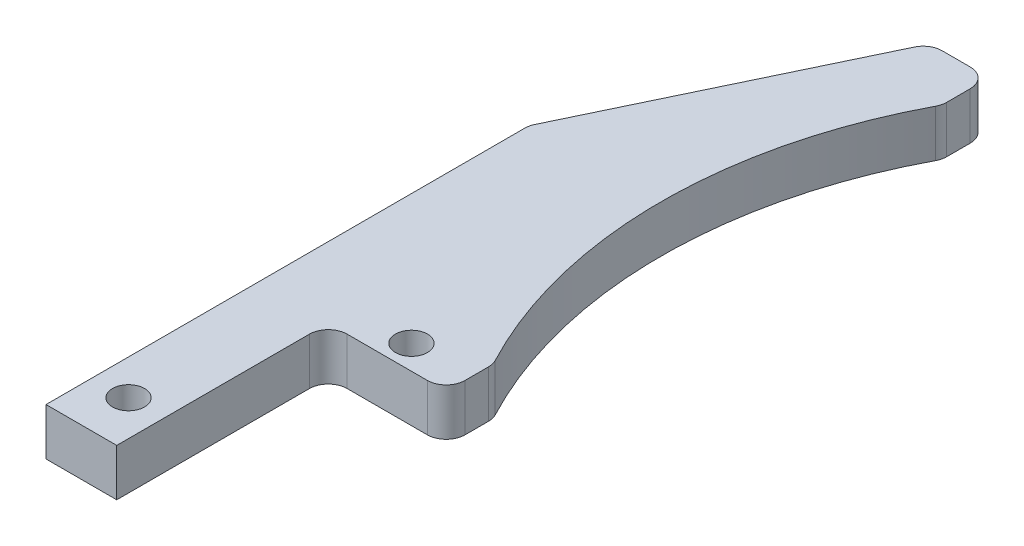
ISO-10303-21;
HEADER;
FILE_DESCRIPTION(('STEP AP214'),'2;1');
FILE_NAME('part.step','',(''),(''),'','','');
FILE_SCHEMA(('AUTOMOTIVE_DESIGN { 1 0 10303 214 1 1 1 1 }'));
ENDSEC;
DATA;
#1=APPLICATION_CONTEXT('core data for automotive mechanical design processes');
#2=APPLICATION_PROTOCOL_DEFINITION('international standard','automotive_design',2000,#1);
#3=PRODUCT_CONTEXT('',#1,'mechanical');
#4=PRODUCT('Part','Part','',(#3));
#5=PRODUCT_RELATED_PRODUCT_CATEGORY('part','',(#4));
#6=PRODUCT_DEFINITION_FORMATION('','',#4);
#7=PRODUCT_DEFINITION_CONTEXT('part definition',#1,'design');
#8=PRODUCT_DEFINITION('design','',#6,#7);
#9=PRODUCT_DEFINITION_SHAPE('','',#8);
#10=(LENGTH_UNIT() NAMED_UNIT(*) SI_UNIT(.MILLI.,.METRE.));
#11=(NAMED_UNIT(*) PLANE_ANGLE_UNIT() SI_UNIT($,.RADIAN.));
#12=(NAMED_UNIT(*) SI_UNIT($,.STERADIAN.) SOLID_ANGLE_UNIT());
#13=UNCERTAINTY_MEASURE_WITH_UNIT(LENGTH_MEASURE(1.E-05),#10,'distance_accuracy_value','');
#14=(GEOMETRIC_REPRESENTATION_CONTEXT(3) GLOBAL_UNCERTAINTY_ASSIGNED_CONTEXT((#13)) GLOBAL_UNIT_ASSIGNED_CONTEXT((#10,
#11,#12)) REPRESENTATION_CONTEXT('',''));
#15=CARTESIAN_POINT('',(0.,0.,0.));
#16=DIRECTION('',(0.,0.,1.));
#17=DIRECTION('',(1.,0.,0.));
#18=AXIS2_PLACEMENT_3D('',#15,#16,#17);
#19=CARTESIAN_POINT('',(9.525,6.35,0.));
#20=DIRECTION('',(-1.,0.,0.));
#21=DIRECTION('',(0.,0.,1.));
#22=AXIS2_PLACEMENT_3D('',#19,#20,#21);
#23=PLANE('',#22);
#24=DIRECTION('',(0.,0.,-1.));
#25=VECTOR('',#24,1.);
#26=CARTESIAN_POINT('',(9.525,0.,0.));
#27=LINE('',#26,#25);
#28=CARTESIAN_POINT('',(9.525,0.,0.));
#29=VERTEX_POINT('',#28);
#30=CARTESIAN_POINT('',(9.525,0.,-25.9496764496661));
#31=VERTEX_POINT('',#30);
#32=EDGE_CURVE('E182',#29,#31,#27,.T.);
#33=ORIENTED_EDGE('',*,*,#32,.T.);
#34=DIRECTION('',(0.,-1.,0.));
#35=VECTOR('',#34,1.);
#36=CARTESIAN_POINT('',(9.525,6.35,-25.9496764496661));
#37=LINE('',#36,#35);
#38=CARTESIAN_POINT('',(9.525,6.35,-25.9496764496661));
#39=VERTEX_POINT('',#38);
#40=EDGE_CURVE('E258',#31,#39,#37,.F.);
#41=ORIENTED_EDGE('',*,*,#40,.T.);
#42=DIRECTION('',(0.,0.,-1.));
#43=VECTOR('',#42,1.);
#44=CARTESIAN_POINT('',(9.525,6.35,0.));
#45=LINE('',#44,#43);
#46=CARTESIAN_POINT('',(9.525,6.35,0.));
#47=VERTEX_POINT('',#46);
#48=EDGE_CURVE('E205',#47,#39,#45,.T.);
#49=ORIENTED_EDGE('',*,*,#48,.F.);
#50=DIRECTION('',(0.,-1.,0.));
#51=VECTOR('',#50,1.);
#52=CARTESIAN_POINT('',(9.525,6.35,0.));
#53=LINE('',#52,#51);
#54=EDGE_CURVE('E173',#47,#29,#53,.T.);
#55=ORIENTED_EDGE('',*,*,#54,.T.);
#56=EDGE_LOOP('',(#33,#41,#49,#55));
#57=FACE_BOUND('',#56,.T.);
#58=ADVANCED_FACE('F41',(#57),#23,.F.);
#59=CARTESIAN_POINT('',(9.525,6.35,-28.4896764496661));
#60=DIRECTION('',(0.,0.,-1.));
#61=DIRECTION('',(-1.,0.,0.));
#62=AXIS2_PLACEMENT_3D('',#59,#60,#61);
#63=PLANE('',#62);
#64=DIRECTION('',(1.,0.,0.));
#65=VECTOR('',#64,1.);
#66=CARTESIAN_POINT('',(9.525,0.,-28.4896764496661));
#67=LINE('',#66,#65);
#68=CARTESIAN_POINT('',(12.065,0.,-28.4896764496661));
#69=VERTEX_POINT('',#68);
#70=CARTESIAN_POINT('',(22.86,0.,-28.4896764496661));
#71=VERTEX_POINT('',#70);
#72=EDGE_CURVE('E185',#69,#71,#67,.T.);
#73=ORIENTED_EDGE('',*,*,#72,.T.);
#74=DIRECTION('',(0.,-1.,0.));
#75=VECTOR('',#74,1.);
#76=CARTESIAN_POINT('',(22.86,6.35,-28.4896764496661));
#77=LINE('',#76,#75);
#78=CARTESIAN_POINT('',(22.86,6.35,-28.4896764496661));
#79=VERTEX_POINT('',#78);
#80=EDGE_CURVE('E256',#71,#79,#77,.F.);
#81=ORIENTED_EDGE('',*,*,#80,.T.);
#82=DIRECTION('',(1.,0.,0.));
#83=VECTOR('',#82,1.);
#84=CARTESIAN_POINT('',(9.525,6.35,-28.4896764496661));
#85=LINE('',#84,#83);
#86=CARTESIAN_POINT('',(12.065,6.35,-28.4896764496661));
#87=VERTEX_POINT('',#86);
#88=EDGE_CURVE('E274',#87,#79,#85,.T.);
#89=ORIENTED_EDGE('',*,*,#88,.F.);
#90=DIRECTION('',(0.,-1.,0.));
#91=VECTOR('',#90,1.);
#92=CARTESIAN_POINT('',(12.065,0.,-28.4896764496661));
#93=LINE('',#92,#91);
#94=EDGE_CURVE('E253',#87,#69,#93,.T.);
#95=ORIENTED_EDGE('',*,*,#94,.T.);
#96=EDGE_LOOP('',(#73,#81,#89,#95));
#97=FACE_BOUND('',#96,.T.);
#98=ADVANCED_FACE('F277',(#97),#63,.F.);
#99=CARTESIAN_POINT('',(25.4,6.35,-28.4896764496661));
#100=DIRECTION('',(-1.,0.,0.));
#101=DIRECTION('',(0.,0.,1.));
#102=AXIS2_PLACEMENT_3D('',#99,#100,#101);
#103=PLANE('',#102);
#104=DIRECTION('',(0.,0.,-1.));
#105=VECTOR('',#104,1.);
#106=CARTESIAN_POINT('',(25.4,0.,-28.4896764496661));
#107=LINE('',#106,#105);
#108=CARTESIAN_POINT('',(25.4,0.,-31.0296764496661));
#109=VERTEX_POINT('',#108);
#110=CARTESIAN_POINT('',(25.4,0.,-34.2035822631082));
#111=VERTEX_POINT('',#110);
#112=EDGE_CURVE('E189',#109,#111,#107,.T.);
#113=ORIENTED_EDGE('',*,*,#112,.T.);
#114=DIRECTION('',(0.,-1.,0.));
#115=VECTOR('',#114,1.);
#116=CARTESIAN_POINT('',(25.4,6.35,-34.2035822631082));
#117=LINE('',#116,#115);
#118=CARTESIAN_POINT('',(25.4,6.35,-34.2035822631082));
#119=VERTEX_POINT('',#118);
#120=EDGE_CURVE('E251',#111,#119,#117,.F.);
#121=ORIENTED_EDGE('',*,*,#120,.T.);
#122=DIRECTION('',(0.,0.,-1.));
#123=VECTOR('',#122,1.);
#124=CARTESIAN_POINT('',(25.4,6.35,-28.4896764496661));
#125=LINE('',#124,#123);
#126=CARTESIAN_POINT('',(25.4,6.35,-31.0296764496661));
#127=VERTEX_POINT('',#126);
#128=EDGE_CURVE('E279',#127,#119,#125,.T.);
#129=ORIENTED_EDGE('',*,*,#128,.F.);
#130=DIRECTION('',(0.,-1.,0.));
#131=VECTOR('',#130,1.);
#132=CARTESIAN_POINT('',(25.4,6.35,-31.0296764496661));
#133=LINE('',#132,#131);
#134=EDGE_CURVE('E248',#127,#109,#133,.T.);
#135=ORIENTED_EDGE('',*,*,#134,.T.);
#136=EDGE_LOOP('',(#113,#121,#129,#135));
#137=FACE_BOUND('',#136,.T.);
#138=ADVANCED_FACE('F329',(#137),#103,.F.);
#139=CARTESIAN_POINT('',(81.2560489305858,6.35,-65.0448382248331));
#140=DIRECTION('',(0.,-1.,0.));
#141=DIRECTION('',(0.,0.,-1.));
#142=AXIS2_PLACEMENT_3D('',#139,#140,#141);
#143=CYLINDRICAL_SURFACE('',#142,63.5);
#144=CARTESIAN_POINT('',(81.2560489305858,0.,-65.0448382248331));
#145=DIRECTION('',(0.,-1.,0.));
#146=DIRECTION('',(0.,0.,-1.));
#147=AXIS2_PLACEMENT_3D('',#144,#145,#146);
#148=CIRCLE('',#147,63.5);
#149=CARTESIAN_POINT('',(25.1060018819456,0.,-35.3897844154822));
#150=VERTEX_POINT('',#149);
#151=CARTESIAN_POINT('',(25.1060018819456,0.,-94.6998920341839));
#152=VERTEX_POINT('',#151);
#153=EDGE_CURVE('E192',#150,#152,#148,.T.);
#154=ORIENTED_EDGE('',*,*,#153,.T.);
#155=DIRECTION('',(0.,-1.,0.));
#156=VECTOR('',#155,1.);
#157=CARTESIAN_POINT('',(25.1060018819456,6.35,-94.6998920341839));
#158=LINE('',#157,#156);
#159=CARTESIAN_POINT('',(25.1060018819456,6.35,-94.6998920341839));
#160=VERTEX_POINT('',#159);
#161=EDGE_CURVE('E246',#152,#160,#158,.F.);
#162=ORIENTED_EDGE('',*,*,#161,.T.);
#163=CARTESIAN_POINT('',(81.2560489305858,6.35,-65.0448382248331));
#164=DIRECTION('',(0.,-1.,0.));
#165=DIRECTION('',(0.,0.,-1.));
#166=AXIS2_PLACEMENT_3D('',#163,#164,#165);
#167=CIRCLE('',#166,63.5);
#168=CARTESIAN_POINT('',(25.1060018819456,6.35,-35.3897844154822));
#169=VERTEX_POINT('',#168);
#170=EDGE_CURVE('E282',#169,#160,#167,.T.);
#171=ORIENTED_EDGE('',*,*,#170,.F.);
#172=DIRECTION('',(0.,-1.,0.));
#173=VECTOR('',#172,1.);
#174=CARTESIAN_POINT('',(25.1060018819456,6.35,-35.3897844154822));
#175=LINE('',#174,#173);
#176=EDGE_CURVE('E243',#169,#150,#175,.T.);
#177=ORIENTED_EDGE('',*,*,#176,.T.);
#178=EDGE_LOOP('',(#154,#162,#171,#177));
#179=FACE_BOUND('',#178,.T.);
#180=ADVANCED_FACE('F320',(#179),#143,.F.);
#181=CARTESIAN_POINT('',(25.4,6.35,-95.25));
#182=DIRECTION('',(-1.,0.,0.));
#183=DIRECTION('',(0.,0.,1.));
#184=AXIS2_PLACEMENT_3D('',#181,#182,#183);
#185=PLANE('',#184);
#186=DIRECTION('',(0.,0.,-1.));
#187=VECTOR('',#186,1.);
#188=CARTESIAN_POINT('',(25.4,0.,-95.25));
#189=LINE('',#188,#187);
#190=CARTESIAN_POINT('',(25.4,0.,-95.8860941865579));
#191=VERTEX_POINT('',#190);
#192=CARTESIAN_POINT('',(25.4,0.,-99.06));
#193=VERTEX_POINT('',#192);
#194=EDGE_CURVE('E195',#191,#193,#189,.T.);
#195=ORIENTED_EDGE('',*,*,#194,.T.);
#196=DIRECTION('',(0.,-1.,0.));
#197=VECTOR('',#196,1.);
#198=CARTESIAN_POINT('',(25.4,6.35,-99.06));
#199=LINE('',#198,#197);
#200=CARTESIAN_POINT('',(25.4,6.35,-99.06));
#201=VERTEX_POINT('',#200);
#202=EDGE_CURVE('E226',#193,#201,#199,.F.);
#203=ORIENTED_EDGE('',*,*,#202,.T.);
#204=DIRECTION('',(0.,0.,-1.));
#205=VECTOR('',#204,1.);
#206=CARTESIAN_POINT('',(25.4,6.35,-95.25));
#207=LINE('',#206,#205);
#208=CARTESIAN_POINT('',(25.4,6.35,-95.8860941865579));
#209=VERTEX_POINT('',#208);
#210=EDGE_CURVE('E289',#209,#201,#207,.T.);
#211=ORIENTED_EDGE('',*,*,#210,.F.);
#212=DIRECTION('',(0.,-1.,0.));
#213=VECTOR('',#212,1.);
#214=CARTESIAN_POINT('',(25.4,6.35,-95.8860941865579));
#215=LINE('',#214,#213);
#216=EDGE_CURVE('E223',#209,#191,#215,.T.);
#217=ORIENTED_EDGE('',*,*,#216,.T.);
#218=EDGE_LOOP('',(#195,#203,#211,#217));
#219=FACE_BOUND('',#218,.T.);
#220=ADVANCED_FACE('F311',(#219),#185,.F.);
#221=CARTESIAN_POINT('',(25.4,6.35,-101.6));
#222=DIRECTION('',(0.,0.,1.));
#223=DIRECTION('',(1.,0.,0.));
#224=AXIS2_PLACEMENT_3D('',#221,#222,#223);
#225=PLANE('',#224);
#226=DIRECTION('',(-1.,0.,0.));
#227=VECTOR('',#226,1.);
#228=CARTESIAN_POINT('',(25.4,6.35,-101.6));
#229=LINE('',#228,#227);
#230=CARTESIAN_POINT('',(22.86,6.35,-101.6));
#231=VERTEX_POINT('',#230);
#232=CARTESIAN_POINT('',(19.0640692731401,6.35,-101.6));
#233=VERTEX_POINT('',#232);
#234=EDGE_CURVE('E291',#231,#233,#229,.T.);
#235=ORIENTED_EDGE('',*,*,#234,.F.);
#236=DIRECTION('',(0.,-1.,0.));
#237=VECTOR('',#236,1.);
#238=CARTESIAN_POINT('',(22.86,6.35,-101.6));
#239=LINE('',#238,#237);
#240=CARTESIAN_POINT('',(22.86,0.,-101.6));
#241=VERTEX_POINT('',#240);
#242=EDGE_CURVE('E208',#231,#241,#239,.T.);
#243=ORIENTED_EDGE('',*,*,#242,.T.);
#244=DIRECTION('',(-1.,0.,0.));
#245=VECTOR('',#244,1.);
#246=CARTESIAN_POINT('',(25.4,0.,-101.6));
#247=LINE('',#246,#245);
#248=CARTESIAN_POINT('',(19.0640692731401,0.,-101.6));
#249=VERTEX_POINT('',#248);
#250=EDGE_CURVE('E198',#241,#249,#247,.T.);
#251=ORIENTED_EDGE('',*,*,#250,.T.);
#252=DIRECTION('',(0.,-1.,0.));
#253=VECTOR('',#252,1.);
#254=CARTESIAN_POINT('',(19.0640692731401,6.35,-101.6));
#255=LINE('',#254,#253);
#256=EDGE_CURVE('E172',#249,#233,#255,.F.);
#257=ORIENTED_EDGE('',*,*,#256,.T.);
#258=EDGE_LOOP('',(#235,#243,#251,#257));
#259=FACE_BOUND('',#258,.T.);
#260=ADVANCED_FACE('F303',(#259),#225,.F.);
#261=CARTESIAN_POINT('',(17.4625,6.35,-101.6));
#262=DIRECTION('',(0.902330160848819,0.,0.431045566990944));
#263=DIRECTION('',(0.431045566990944,0.,-0.902330160848819));
#264=AXIS2_PLACEMENT_3D('',#261,#262,#263);
#265=PLANE('',#264);
#266=DIRECTION('',(-0.431045566990944,0.,0.902330160848819));
#267=VECTOR('',#266,1.);
#268=CARTESIAN_POINT('',(17.4625,6.35,-101.6));
#269=LINE('',#268,#267);
#270=CARTESIAN_POINT('',(16.7721506645841,6.35,-100.154855740157));
#271=VERTEX_POINT('',#270);
#272=CARTESIAN_POINT('',(0.248081391443996,6.35,-65.5641599369387));
#273=VERTEX_POINT('',#272);
#274=EDGE_CURVE('E163',#271,#273,#269,.T.);
#275=ORIENTED_EDGE('',*,*,#274,.F.);
#276=DIRECTION('',(0.,-1.,0.));
#277=VECTOR('',#276,1.);
#278=CARTESIAN_POINT('',(16.7721506645841,6.35,-100.154855740157));
#279=LINE('',#278,#277);
#280=CARTESIAN_POINT('',(16.7721506645841,0.,-100.154855740157));
#281=VERTEX_POINT('',#280);
#282=EDGE_CURVE('E240',#271,#281,#279,.T.);
#283=ORIENTED_EDGE('',*,*,#282,.T.);
#284=DIRECTION('',(-0.431045566990944,0.,0.902330160848819));
#285=VECTOR('',#284,1.);
#286=CARTESIAN_POINT('',(17.4625,0.,-101.6));
#287=LINE('',#286,#285);
#288=CARTESIAN_POINT('',(0.248081391443996,0.,-65.5641599369387));
#289=VERTEX_POINT('',#288);
#290=EDGE_CURVE('E201',#281,#289,#287,.T.);
#291=ORIENTED_EDGE('',*,*,#290,.T.);
#292=DIRECTION('',(0.,-1.,0.));
#293=VECTOR('',#292,1.);
#294=CARTESIAN_POINT('',(0.248081391443996,6.35,-65.5641599369387));
#295=LINE('',#294,#293);
#296=EDGE_CURVE('E64',#289,#273,#295,.F.);
#297=ORIENTED_EDGE('',*,*,#296,.T.);
#298=EDGE_LOOP('',(#275,#283,#291,#297));
#299=FACE_BOUND('',#298,.T.);
#300=ADVANCED_FACE('F297',(#299),#265,.F.);
#301=CARTESIAN_POINT('',(0.,6.35,-65.0448382248331));
#302=DIRECTION('',(1.,0.,0.));
#303=DIRECTION('',(0.,0.,-1.));
#304=AXIS2_PLACEMENT_3D('',#301,#302,#303);
#305=PLANE('',#304);
#306=DIRECTION('',(0.,0.,1.));
#307=VECTOR('',#306,1.);
#308=CARTESIAN_POINT('',(0.,6.35,-65.0448382248331));
#309=LINE('',#308,#307);
#310=CARTESIAN_POINT('',(0.,6.35,-64.4693041967816));
#311=VERTEX_POINT('',#310);
#312=CARTESIAN_POINT('',(0.,6.35,0.));
#313=VERTEX_POINT('',#312);
#314=EDGE_CURVE('E152',#311,#313,#309,.T.);
#315=ORIENTED_EDGE('',*,*,#314,.F.);
#316=DIRECTION('',(0.,-1.,0.));
#317=VECTOR('',#316,1.);
#318=CARTESIAN_POINT('',(0.,6.35,-64.4693041967816));
#319=LINE('',#318,#317);
#320=CARTESIAN_POINT('',(0.,0.,-64.4693041967816));
#321=VERTEX_POINT('',#320);
#322=EDGE_CURVE('E260',#311,#321,#319,.T.);
#323=ORIENTED_EDGE('',*,*,#322,.T.);
#324=DIRECTION('',(0.,0.,1.));
#325=VECTOR('',#324,1.);
#326=CARTESIAN_POINT('',(0.,0.,-65.0448382248331));
#327=LINE('',#326,#325);
#328=CARTESIAN_POINT('',(0.,0.,0.));
#329=VERTEX_POINT('',#328);
#330=EDGE_CURVE('E169',#321,#329,#327,.T.);
#331=ORIENTED_EDGE('',*,*,#330,.T.);
#332=DIRECTION('',(0.,-1.,0.));
#333=VECTOR('',#332,1.);
#334=CARTESIAN_POINT('',(0.,6.35,0.));
#335=LINE('',#334,#333);
#336=EDGE_CURVE('E166',#313,#329,#335,.T.);
#337=ORIENTED_EDGE('',*,*,#336,.F.);
#338=EDGE_LOOP('',(#315,#323,#331,#337));
#339=FACE_BOUND('',#338,.T.);
#340=ADVANCED_FACE('F167',(#339),#305,.F.);
#341=CARTESIAN_POINT('',(0.,6.35,0.));
#342=DIRECTION('',(0.,0.,-1.));
#343=DIRECTION('',(-1.,0.,0.));
#344=AXIS2_PLACEMENT_3D('',#341,#342,#343);
#345=PLANE('',#344);
#346=DIRECTION('',(1.,0.,0.));
#347=VECTOR('',#346,1.);
#348=CARTESIAN_POINT('',(0.,0.,0.));
#349=LINE('',#348,#347);
#350=EDGE_CURVE('E204',#329,#29,#349,.T.);
#351=ORIENTED_EDGE('',*,*,#350,.T.);
#352=ORIENTED_EDGE('',*,*,#54,.F.);
#353=DIRECTION('',(1.,0.,0.));
#354=VECTOR('',#353,1.);
#355=CARTESIAN_POINT('',(0.,6.35,0.));
#356=LINE('',#355,#354);
#357=EDGE_CURVE('E158',#313,#47,#356,.T.);
#358=ORIENTED_EDGE('',*,*,#357,.F.);
#359=ORIENTED_EDGE('',*,*,#336,.T.);
#360=EDGE_LOOP('',(#351,#352,#358,#359));
#361=FACE_BOUND('',#360,.T.);
#362=ADVANCED_FACE('F175',(#361),#345,.F.);
#363=CARTESIAN_POINT('',(81.2560489305858,6.35,-65.0448382248331));
#364=DIRECTION('',(0.,-1.,0.));
#365=DIRECTION('',(0.,0.,-1.));
#366=AXIS2_PLACEMENT_3D('',#363,#364,#365);
#367=PLANE('',#366);
#368=CARTESIAN_POINT('',(17.4625,6.35,-31.75));
#369=DIRECTION('',(0.,1.,0.));
#370=DIRECTION('',(0.,0.,1.));
#371=AXIS2_PLACEMENT_3D('',#368,#369,#370);
#372=CIRCLE('',#371,2.15900000000001);
#373=CARTESIAN_POINT('',(17.4625,6.35,-29.591));
#374=VERTEX_POINT('',#373);
#375=EDGE_CURVE('E501',#374,#374,#372,.T.);
#376=ORIENTED_EDGE('',*,*,#375,.F.);
#377=EDGE_LOOP('',(#376));
#378=FACE_BOUND('',#377,.T.);
#379=CARTESIAN_POINT('',(4.7625,6.35,-6.35));
#380=DIRECTION('',(0.,1.,0.));
#381=DIRECTION('',(0.,0.,1.));
#382=AXIS2_PLACEMENT_3D('',#379,#380,#381);
#383=CIRCLE('',#382,2.159);
#384=CARTESIAN_POINT('',(4.7625,6.35,-4.191));
#385=VERTEX_POINT('',#384);
#386=EDGE_CURVE('E504',#385,#385,#383,.T.);
#387=ORIENTED_EDGE('',*,*,#386,.F.);
#388=EDGE_LOOP('',(#387));
#389=FACE_BOUND('',#388,.T.);
#390=ORIENTED_EDGE('',*,*,#210,.T.);
#391=CARTESIAN_POINT('',(22.86,6.35,-99.06));
#392=DIRECTION('',(0.,-1.,0.));
#393=DIRECTION('',(0.,0.,-1.));
#394=AXIS2_PLACEMENT_3D('',#391,#392,#393);
#395=CIRCLE('',#394,2.54);
#396=EDGE_CURVE('E237',#201,#231,#395,.F.);
#397=ORIENTED_EDGE('',*,*,#396,.T.);
#398=ORIENTED_EDGE('',*,*,#234,.T.);
#399=CARTESIAN_POINT('',(19.0640692731401,6.35,-99.06));
#400=DIRECTION('',(0.,-1.,0.));
#401=DIRECTION('',(0.,0.,-1.));
#402=AXIS2_PLACEMENT_3D('',#399,#400,#401);
#403=CIRCLE('',#402,2.54);
#404=EDGE_CURVE('E235',#233,#271,#403,.F.);
#405=ORIENTED_EDGE('',*,*,#404,.T.);
#406=ORIENTED_EDGE('',*,*,#274,.T.);
#407=CARTESIAN_POINT('',(2.54,6.35,-64.4693041967816));
#408=DIRECTION('',(0.,-1.,0.));
#409=DIRECTION('',(0.,0.,-1.));
#410=AXIS2_PLACEMENT_3D('',#407,#408,#409);
#411=CIRCLE('',#410,2.54);
#412=EDGE_CURVE('E56',#273,#311,#411,.F.);
#413=ORIENTED_EDGE('',*,*,#412,.T.);
#414=ORIENTED_EDGE('',*,*,#314,.T.);
#415=ORIENTED_EDGE('',*,*,#357,.T.);
#416=ORIENTED_EDGE('',*,*,#48,.T.);
#417=CARTESIAN_POINT('',(12.065,6.35,-25.9496764496661));
#418=DIRECTION('',(0.,-1.,0.));
#419=DIRECTION('',(0.,0.,-1.));
#420=AXIS2_PLACEMENT_3D('',#417,#418,#419);
#421=CIRCLE('',#420,2.54);
#422=EDGE_CURVE('E11',#39,#87,#421,.T.);
#423=ORIENTED_EDGE('',*,*,#422,.T.);
#424=ORIENTED_EDGE('',*,*,#88,.T.);
#425=CARTESIAN_POINT('',(22.86,6.35,-31.0296764496661));
#426=DIRECTION('',(0.,-1.,0.));
#427=DIRECTION('',(0.,0.,-1.));
#428=AXIS2_PLACEMENT_3D('',#425,#426,#427);
#429=CIRCLE('',#428,2.54);
#430=EDGE_CURVE('E229',#79,#127,#429,.F.);
#431=ORIENTED_EDGE('',*,*,#430,.T.);
#432=ORIENTED_EDGE('',*,*,#128,.T.);
#433=CARTESIAN_POINT('',(22.86,6.35,-34.2035822631082));
#434=DIRECTION('',(0.,-1.,0.));
#435=DIRECTION('',(0.,0.,-1.));
#436=AXIS2_PLACEMENT_3D('',#433,#434,#435);
#437=CIRCLE('',#436,2.54);
#438=EDGE_CURVE('E231',#119,#169,#437,.F.);
#439=ORIENTED_EDGE('',*,*,#438,.T.);
#440=ORIENTED_EDGE('',*,*,#170,.T.);
#441=CARTESIAN_POINT('',(22.86,6.35,-95.8860941865579));
#442=DIRECTION('',(0.,-1.,0.));
#443=DIRECTION('',(0.,0.,-1.));
#444=AXIS2_PLACEMENT_3D('',#441,#442,#443);
#445=CIRCLE('',#444,2.54);
#446=EDGE_CURVE('E233',#160,#209,#445,.F.);
#447=ORIENTED_EDGE('',*,*,#446,.T.);
#448=EDGE_LOOP('',(#390,#397,#398,#405,#406,#413,#414,#415,#416,#423,#424,#431,#432,#439,#440,#447));
#449=FACE_BOUND('',#448,.T.);
#450=ADVANCED_FACE('F155',(#378,#389,#449),#367,.F.);
#451=CARTESIAN_POINT('',(81.2560489305858,0.,-65.0448382248331));
#452=DIRECTION('',(0.,-1.,0.));
#453=DIRECTION('',(0.,0.,-1.));
#454=AXIS2_PLACEMENT_3D('',#451,#452,#453);
#455=PLANE('',#454);
#456=CARTESIAN_POINT('',(17.4625,0.,-31.75));
#457=DIRECTION('',(0.,1.,0.));
#458=DIRECTION('',(0.,0.,1.));
#459=AXIS2_PLACEMENT_3D('',#456,#457,#458);
#460=CIRCLE('',#459,2.15900000000001);
#461=CARTESIAN_POINT('',(17.4625,0.,-29.591));
#462=VERTEX_POINT('',#461);
#463=EDGE_CURVE('E186',#462,#462,#460,.T.);
#464=ORIENTED_EDGE('',*,*,#463,.T.);
#465=EDGE_LOOP('',(#464));
#466=FACE_BOUND('',#465,.T.);
#467=CARTESIAN_POINT('',(4.7625,0.,-6.35));
#468=DIRECTION('',(0.,1.,0.));
#469=DIRECTION('',(0.,0.,1.));
#470=AXIS2_PLACEMENT_3D('',#467,#468,#469);
#471=CIRCLE('',#470,2.159);
#472=CARTESIAN_POINT('',(4.7625,0.,-4.191));
#473=VERTEX_POINT('',#472);
#474=EDGE_CURVE('E506',#473,#473,#471,.T.);
#475=ORIENTED_EDGE('',*,*,#474,.T.);
#476=EDGE_LOOP('',(#475));
#477=FACE_BOUND('',#476,.T.);
#478=ORIENTED_EDGE('',*,*,#250,.F.);
#479=CARTESIAN_POINT('',(22.86,0.,-99.06));
#480=DIRECTION('',(0.,-1.,0.));
#481=DIRECTION('',(0.,0.,-1.));
#482=AXIS2_PLACEMENT_3D('',#479,#480,#481);
#483=CIRCLE('',#482,2.54);
#484=EDGE_CURVE('E221',#241,#193,#483,.T.);
#485=ORIENTED_EDGE('',*,*,#484,.T.);
#486=ORIENTED_EDGE('',*,*,#194,.F.);
#487=CARTESIAN_POINT('',(22.86,0.,-95.8860941865579));
#488=DIRECTION('',(0.,-1.,0.));
#489=DIRECTION('',(0.,0.,-1.));
#490=AXIS2_PLACEMENT_3D('',#487,#488,#489);
#491=CIRCLE('',#490,2.54);
#492=EDGE_CURVE('E217',#191,#152,#491,.T.);
#493=ORIENTED_EDGE('',*,*,#492,.T.);
#494=ORIENTED_EDGE('',*,*,#153,.F.);
#495=CARTESIAN_POINT('',(22.86,0.,-34.2035822631082));
#496=DIRECTION('',(0.,-1.,0.));
#497=DIRECTION('',(0.,0.,-1.));
#498=AXIS2_PLACEMENT_3D('',#495,#496,#497);
#499=CIRCLE('',#498,2.54);
#500=EDGE_CURVE('E215',#150,#111,#499,.T.);
#501=ORIENTED_EDGE('',*,*,#500,.T.);
#502=ORIENTED_EDGE('',*,*,#112,.F.);
#503=CARTESIAN_POINT('',(22.86,0.,-31.0296764496661));
#504=DIRECTION('',(0.,-1.,0.));
#505=DIRECTION('',(0.,0.,-1.));
#506=AXIS2_PLACEMENT_3D('',#503,#504,#505);
#507=CIRCLE('',#506,2.54);
#508=EDGE_CURVE('E213',#109,#71,#507,.T.);
#509=ORIENTED_EDGE('',*,*,#508,.T.);
#510=ORIENTED_EDGE('',*,*,#72,.F.);
#511=CARTESIAN_POINT('',(12.065,0.,-25.9496764496661));
#512=DIRECTION('',(0.,-1.,0.));
#513=DIRECTION('',(0.,0.,-1.));
#514=AXIS2_PLACEMENT_3D('',#511,#512,#513);
#515=CIRCLE('',#514,2.54);
#516=EDGE_CURVE('E49',#69,#31,#515,.F.);
#517=ORIENTED_EDGE('',*,*,#516,.T.);
#518=ORIENTED_EDGE('',*,*,#32,.F.);
#519=ORIENTED_EDGE('',*,*,#350,.F.);
#520=ORIENTED_EDGE('',*,*,#330,.F.);
#521=CARTESIAN_POINT('',(2.54,0.,-64.4693041967816));
#522=DIRECTION('',(0.,-1.,0.));
#523=DIRECTION('',(0.,0.,-1.));
#524=AXIS2_PLACEMENT_3D('',#521,#522,#523);
#525=CIRCLE('',#524,2.54);
#526=EDGE_CURVE('E211',#321,#289,#525,.T.);
#527=ORIENTED_EDGE('',*,*,#526,.T.);
#528=ORIENTED_EDGE('',*,*,#290,.F.);
#529=CARTESIAN_POINT('',(19.0640692731401,0.,-99.06));
#530=DIRECTION('',(0.,-1.,0.));
#531=DIRECTION('',(0.,0.,-1.));
#532=AXIS2_PLACEMENT_3D('',#529,#530,#531);
#533=CIRCLE('',#532,2.54);
#534=EDGE_CURVE('E219',#281,#249,#533,.T.);
#535=ORIENTED_EDGE('',*,*,#534,.T.);
#536=EDGE_LOOP('',(#478,#485,#486,#493,#494,#501,#502,#509,#510,#517,#518,#519,#520,#527,#528,#535));
#537=FACE_BOUND('',#536,.T.);
#538=ADVANCED_FACE('F265',(#466,#477,#537),#455,.T.);
#539=CARTESIAN_POINT('',(4.7625,0.,-6.35));
#540=DIRECTION('',(0.,1.,0.));
#541=DIRECTION('',(0.,0.,1.));
#542=AXIS2_PLACEMENT_3D('',#539,#540,#541);
#543=CYLINDRICAL_SURFACE('',#542,2.159);
#544=ORIENTED_EDGE('',*,*,#474,.F.);
#545=EDGE_LOOP('',(#544));
#546=FACE_BOUND('',#545,.T.);
#547=ORIENTED_EDGE('',*,*,#386,.T.);
#548=EDGE_LOOP('',(#547));
#549=FACE_BOUND('',#548,.T.);
#550=ADVANCED_FACE('F400',(#546,#549),#543,.F.);
#551=CARTESIAN_POINT('',(17.4625,0.,-31.75));
#552=DIRECTION('',(0.,1.,0.));
#553=DIRECTION('',(0.,0.,1.));
#554=AXIS2_PLACEMENT_3D('',#551,#552,#553);
#555=CYLINDRICAL_SURFACE('',#554,2.15900000000001);
#556=ORIENTED_EDGE('',*,*,#463,.F.);
#557=EDGE_LOOP('',(#556));
#558=FACE_BOUND('',#557,.T.);
#559=ORIENTED_EDGE('',*,*,#375,.T.);
#560=EDGE_LOOP('',(#559));
#561=FACE_BOUND('',#560,.T.);
#562=ADVANCED_FACE('F352',(#558,#561),#555,.F.);
#563=CARTESIAN_POINT('',(22.86,6.35,-99.06));
#564=DIRECTION('',(0.,-1.,0.));
#565=DIRECTION('',(0.,0.,-1.));
#566=AXIS2_PLACEMENT_3D('',#563,#564,#565);
#567=CYLINDRICAL_SURFACE('',#566,2.54);
#568=ORIENTED_EDGE('',*,*,#396,.F.);
#569=ORIENTED_EDGE('',*,*,#202,.F.);
#570=ORIENTED_EDGE('',*,*,#484,.F.);
#571=ORIENTED_EDGE('',*,*,#242,.F.);
#572=EDGE_LOOP('',(#568,#569,#570,#571));
#573=FACE_BOUND('',#572,.T.);
#574=ADVANCED_FACE('F307',(#573),#567,.T.);
#575=CARTESIAN_POINT('',(19.0640692731401,6.35,-99.06));
#576=DIRECTION('',(0.,-1.,0.));
#577=DIRECTION('',(0.,0.,-1.));
#578=AXIS2_PLACEMENT_3D('',#575,#576,#577);
#579=CYLINDRICAL_SURFACE('',#578,2.54);
#580=ORIENTED_EDGE('',*,*,#404,.F.);
#581=ORIENTED_EDGE('',*,*,#256,.F.);
#582=ORIENTED_EDGE('',*,*,#534,.F.);
#583=ORIENTED_EDGE('',*,*,#282,.F.);
#584=EDGE_LOOP('',(#580,#581,#582,#583));
#585=FACE_BOUND('',#584,.T.);
#586=ADVANCED_FACE('F299',(#585),#579,.T.);
#587=CARTESIAN_POINT('',(22.86,6.35,-95.8860941865579));
#588=DIRECTION('',(0.,-1.,0.));
#589=DIRECTION('',(0.,0.,-1.));
#590=AXIS2_PLACEMENT_3D('',#587,#588,#589);
#591=CYLINDRICAL_SURFACE('',#590,2.54);
#592=ORIENTED_EDGE('',*,*,#446,.F.);
#593=ORIENTED_EDGE('',*,*,#161,.F.);
#594=ORIENTED_EDGE('',*,*,#492,.F.);
#595=ORIENTED_EDGE('',*,*,#216,.F.);
#596=EDGE_LOOP('',(#592,#593,#594,#595));
#597=FACE_BOUND('',#596,.T.);
#598=ADVANCED_FACE('F316',(#597),#591,.T.);
#599=CARTESIAN_POINT('',(22.86,6.35,-34.2035822631082));
#600=DIRECTION('',(0.,-1.,0.));
#601=DIRECTION('',(0.,0.,-1.));
#602=AXIS2_PLACEMENT_3D('',#599,#600,#601);
#603=CYLINDRICAL_SURFACE('',#602,2.54);
#604=ORIENTED_EDGE('',*,*,#438,.F.);
#605=ORIENTED_EDGE('',*,*,#120,.F.);
#606=ORIENTED_EDGE('',*,*,#500,.F.);
#607=ORIENTED_EDGE('',*,*,#176,.F.);
#608=EDGE_LOOP('',(#604,#605,#606,#607));
#609=FACE_BOUND('',#608,.T.);
#610=ADVANCED_FACE('F325',(#609),#603,.T.);
#611=CARTESIAN_POINT('',(22.86,6.35,-31.0296764496661));
#612=DIRECTION('',(0.,-1.,0.));
#613=DIRECTION('',(0.,0.,-1.));
#614=AXIS2_PLACEMENT_3D('',#611,#612,#613);
#615=CYLINDRICAL_SURFACE('',#614,2.54);
#616=ORIENTED_EDGE('',*,*,#430,.F.);
#617=ORIENTED_EDGE('',*,*,#80,.F.);
#618=ORIENTED_EDGE('',*,*,#508,.F.);
#619=ORIENTED_EDGE('',*,*,#134,.F.);
#620=EDGE_LOOP('',(#616,#617,#618,#619));
#621=FACE_BOUND('',#620,.T.);
#622=ADVANCED_FACE('F333',(#621),#615,.T.);
#623=CARTESIAN_POINT('',(12.065,6.35,-25.9496764496661));
#624=DIRECTION('',(0.,1.,0.));
#625=DIRECTION('',(0.,0.,1.));
#626=AXIS2_PLACEMENT_3D('',#623,#624,#625);
#627=CYLINDRICAL_SURFACE('',#626,2.54);
#628=ORIENTED_EDGE('',*,*,#422,.F.);
#629=ORIENTED_EDGE('',*,*,#40,.F.);
#630=ORIENTED_EDGE('',*,*,#516,.F.);
#631=ORIENTED_EDGE('',*,*,#94,.F.);
#632=EDGE_LOOP('',(#628,#629,#630,#631));
#633=FACE_BOUND('',#632,.T.);
#634=ADVANCED_FACE('F271',(#633),#627,.F.);
#635=CARTESIAN_POINT('',(2.54,6.35,-64.4693041967816));
#636=DIRECTION('',(0.,-1.,0.));
#637=DIRECTION('',(0.,0.,-1.));
#638=AXIS2_PLACEMENT_3D('',#635,#636,#637);
#639=CYLINDRICAL_SURFACE('',#638,2.54);
#640=ORIENTED_EDGE('',*,*,#412,.F.);
#641=ORIENTED_EDGE('',*,*,#296,.F.);
#642=ORIENTED_EDGE('',*,*,#526,.F.);
#643=ORIENTED_EDGE('',*,*,#322,.F.);
#644=EDGE_LOOP('',(#640,#641,#642,#643));
#645=FACE_BOUND('',#644,.T.);
#646=ADVANCED_FACE('F43',(#645),#639,.T.);
#647=CLOSED_SHELL('',(#58,#98,#138,#180,#220,#260,#300,#340,#362,#450,#538,#550,#562,#574,#586,
#598,#610,#622,#634,#646));
#648=MANIFOLD_SOLID_BREP('B2',#647);
#649=ADVANCED_BREP_SHAPE_REPRESENTATION('',(#18,#648),#14);
#650=SHAPE_DEFINITION_REPRESENTATION(#9,#649);
ENDSEC;
END-ISO-10303-21;
